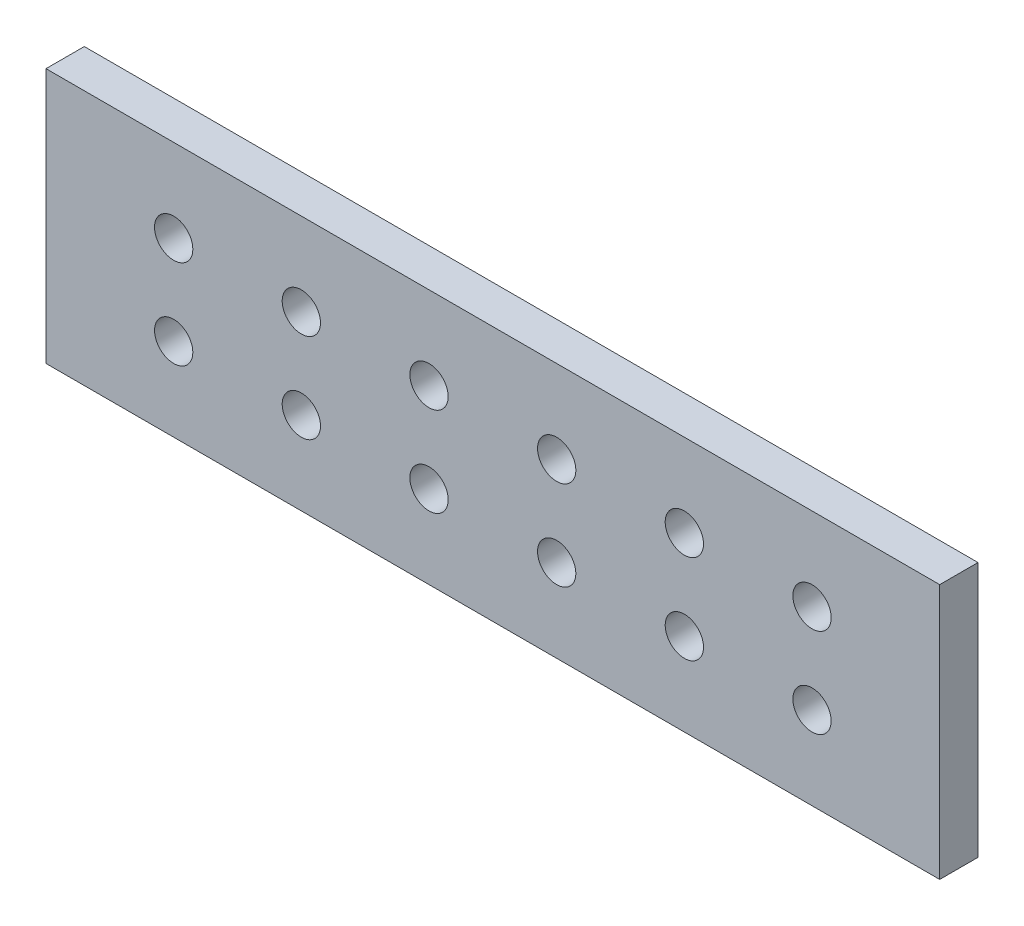
ISO-10303-21;
HEADER;
FILE_DESCRIPTION(('STEP AP214'),'2;1');
FILE_NAME('part.step','',(''),(''),'','','');
FILE_SCHEMA(('AUTOMOTIVE_DESIGN { 1 0 10303 214 1 1 1 1 }'));
ENDSEC;
DATA;
#1=APPLICATION_CONTEXT('core data for automotive mechanical design processes');
#2=APPLICATION_PROTOCOL_DEFINITION('international standard','automotive_design',2000,#1);
#3=PRODUCT_CONTEXT('',#1,'mechanical');
#4=PRODUCT('Part','Part','',(#3));
#5=PRODUCT_RELATED_PRODUCT_CATEGORY('part','',(#4));
#6=PRODUCT_DEFINITION_FORMATION('','',#4);
#7=PRODUCT_DEFINITION_CONTEXT('part definition',#1,'design');
#8=PRODUCT_DEFINITION('design','',#6,#7);
#9=PRODUCT_DEFINITION_SHAPE('','',#8);
#10=(LENGTH_UNIT() NAMED_UNIT(*) SI_UNIT(.MILLI.,.METRE.));
#11=(NAMED_UNIT(*) PLANE_ANGLE_UNIT() SI_UNIT($,.RADIAN.));
#12=(NAMED_UNIT(*) SI_UNIT($,.STERADIAN.) SOLID_ANGLE_UNIT());
#13=UNCERTAINTY_MEASURE_WITH_UNIT(LENGTH_MEASURE(1.E-05),#10,'distance_accuracy_value','');
#14=(GEOMETRIC_REPRESENTATION_CONTEXT(3) GLOBAL_UNCERTAINTY_ASSIGNED_CONTEXT((#13)) GLOBAL_UNIT_ASSIGNED_CONTEXT((#10,
#11,#12)) REPRESENTATION_CONTEXT('',''));
#15=CARTESIAN_POINT('',(0.,0.,0.));
#16=DIRECTION('',(0.,0.,1.));
#17=DIRECTION('',(1.,0.,0.));
#18=AXIS2_PLACEMENT_3D('',#15,#16,#17);
#19=CARTESIAN_POINT('',(0.,0.,3.));
#20=DIRECTION('',(0.,0.,1.));
#21=DIRECTION('',(1.,0.,0.));
#22=AXIS2_PLACEMENT_3D('',#19,#20,#21);
#23=PLANE('',#22);
#24=CARTESIAN_POINT('',(15.,-3.5,3.));
#25=DIRECTION('',(0.,0.,1.));
#26=DIRECTION('',(1.,0.,0.));
#27=AXIS2_PLACEMENT_3D('',#24,#25,#26);
#28=CIRCLE('',#27,1.5);
#29=CARTESIAN_POINT('',(16.5,-3.5,3.));
#30=VERTEX_POINT('',#29);
#31=EDGE_CURVE('E172',#30,#30,#28,.T.);
#32=ORIENTED_EDGE('',*,*,#31,.F.);
#33=EDGE_LOOP('',(#32));
#34=FACE_BOUND('',#33,.T.);
#35=CARTESIAN_POINT('',(-4.99999999999999,-3.5,3.));
#36=DIRECTION('',(0.,0.,1.));
#37=DIRECTION('',(1.,0.,0.));
#38=AXIS2_PLACEMENT_3D('',#35,#36,#37);
#39=CIRCLE('',#38,1.5);
#40=CARTESIAN_POINT('',(-3.49999999999999,-3.5,3.));
#41=VERTEX_POINT('',#40);
#42=EDGE_CURVE('E160',#41,#41,#39,.T.);
#43=ORIENTED_EDGE('',*,*,#42,.F.);
#44=EDGE_LOOP('',(#43));
#45=FACE_BOUND('',#44,.T.);
#46=CARTESIAN_POINT('',(25.,3.5,3.));
#47=DIRECTION('',(0.,0.,1.));
#48=DIRECTION('',(1.,0.,0.));
#49=AXIS2_PLACEMENT_3D('',#46,#47,#48);
#50=CIRCLE('',#49,1.5);
#51=CARTESIAN_POINT('',(26.5,3.5,3.));
#52=VERTEX_POINT('',#51);
#53=EDGE_CURVE('E148',#52,#52,#50,.T.);
#54=ORIENTED_EDGE('',*,*,#53,.F.);
#55=EDGE_LOOP('',(#54));
#56=FACE_BOUND('',#55,.T.);
#57=CARTESIAN_POINT('',(5.00000000000001,3.5,3.));
#58=DIRECTION('',(0.,0.,1.));
#59=DIRECTION('',(1.,0.,0.));
#60=AXIS2_PLACEMENT_3D('',#57,#58,#59);
#61=CIRCLE('',#60,1.5);
#62=CARTESIAN_POINT('',(6.50000000000002,3.5,3.));
#63=VERTEX_POINT('',#62);
#64=EDGE_CURVE('E136',#63,#63,#61,.T.);
#65=ORIENTED_EDGE('',*,*,#64,.F.);
#66=EDGE_LOOP('',(#65));
#67=FACE_BOUND('',#66,.T.);
#68=CARTESIAN_POINT('',(-15.,3.5,3.));
#69=DIRECTION('',(0.,0.,1.));
#70=DIRECTION('',(1.,0.,0.));
#71=AXIS2_PLACEMENT_3D('',#68,#69,#70);
#72=CIRCLE('',#71,1.5);
#73=CARTESIAN_POINT('',(-13.5,3.5,3.));
#74=VERTEX_POINT('',#73);
#75=EDGE_CURVE('E124',#74,#74,#72,.T.);
#76=ORIENTED_EDGE('',*,*,#75,.F.);
#77=EDGE_LOOP('',(#76));
#78=FACE_BOUND('',#77,.T.);
#79=CARTESIAN_POINT('',(-25.,3.5,3.));
#80=DIRECTION('',(0.,0.,1.));
#81=DIRECTION('',(1.,0.,0.));
#82=AXIS2_PLACEMENT_3D('',#79,#80,#81);
#83=CIRCLE('',#82,1.5);
#84=CARTESIAN_POINT('',(-23.5,3.5,3.));
#85=VERTEX_POINT('',#84);
#86=EDGE_CURVE('E103',#85,#85,#83,.T.);
#87=ORIENTED_EDGE('',*,*,#86,.F.);
#88=EDGE_LOOP('',(#87));
#89=FACE_BOUND('',#88,.T.);
#90=DIRECTION('',(0.,1.,0.));
#91=VECTOR('',#90,1.);
#92=CARTESIAN_POINT('',(35.,10.,3.));
#93=LINE('',#92,#91);
#94=CARTESIAN_POINT('',(35.,-10.,3.));
#95=VERTEX_POINT('',#94);
#96=CARTESIAN_POINT('',(35.,10.,3.));
#97=VERTEX_POINT('',#96);
#98=EDGE_CURVE('E88',#95,#97,#93,.T.);
#99=ORIENTED_EDGE('',*,*,#98,.T.);
#100=DIRECTION('',(-1.,0.,0.));
#101=VECTOR('',#100,1.);
#102=CARTESIAN_POINT('',(-35.,10.,3.));
#103=LINE('',#102,#101);
#104=CARTESIAN_POINT('',(-35.,10.,3.));
#105=VERTEX_POINT('',#104);
#106=EDGE_CURVE('E83',#97,#105,#103,.T.);
#107=ORIENTED_EDGE('',*,*,#106,.T.);
#108=DIRECTION('',(0.,-1.,0.));
#109=VECTOR('',#108,1.);
#110=CARTESIAN_POINT('',(-35.,10.,3.));
#111=LINE('',#110,#109);
#112=CARTESIAN_POINT('',(-35.,-10.,3.));
#113=VERTEX_POINT('',#112);
#114=EDGE_CURVE('E86',#105,#113,#111,.T.);
#115=ORIENTED_EDGE('',*,*,#114,.T.);
#116=DIRECTION('',(1.,0.,0.));
#117=VECTOR('',#116,1.);
#118=CARTESIAN_POINT('',(-35.,-10.,3.));
#119=LINE('',#118,#117);
#120=EDGE_CURVE('E53',#113,#95,#119,.T.);
#121=ORIENTED_EDGE('',*,*,#120,.T.);
#122=EDGE_LOOP('',(#99,#107,#115,#121));
#123=FACE_BOUND('',#122,.T.);
#124=CARTESIAN_POINT('',(-25.,-3.5,3.));
#125=DIRECTION('',(0.,0.,1.));
#126=DIRECTION('',(1.,0.,0.));
#127=AXIS2_PLACEMENT_3D('',#124,#125,#126);
#128=CIRCLE('',#127,1.5);
#129=CARTESIAN_POINT('',(-23.5,-3.5,3.));
#130=VERTEX_POINT('',#129);
#131=EDGE_CURVE('E118',#130,#130,#128,.T.);
#132=ORIENTED_EDGE('',*,*,#131,.F.);
#133=EDGE_LOOP('',(#132));
#134=FACE_BOUND('',#133,.T.);
#135=CARTESIAN_POINT('',(-4.99999999999999,3.5,3.));
#136=DIRECTION('',(0.,0.,1.));
#137=DIRECTION('',(1.,0.,0.));
#138=AXIS2_PLACEMENT_3D('',#135,#136,#137);
#139=CIRCLE('',#138,1.5);
#140=CARTESIAN_POINT('',(-3.49999999999999,3.5,3.));
#141=VERTEX_POINT('',#140);
#142=EDGE_CURVE('E130',#141,#141,#139,.T.);
#143=ORIENTED_EDGE('',*,*,#142,.F.);
#144=EDGE_LOOP('',(#143));
#145=FACE_BOUND('',#144,.T.);
#146=CARTESIAN_POINT('',(15.,3.5,3.));
#147=DIRECTION('',(0.,0.,1.));
#148=DIRECTION('',(1.,0.,0.));
#149=AXIS2_PLACEMENT_3D('',#146,#147,#148);
#150=CIRCLE('',#149,1.5);
#151=CARTESIAN_POINT('',(16.5,3.5,3.));
#152=VERTEX_POINT('',#151);
#153=EDGE_CURVE('E142',#152,#152,#150,.T.);
#154=ORIENTED_EDGE('',*,*,#153,.F.);
#155=EDGE_LOOP('',(#154));
#156=FACE_BOUND('',#155,.T.);
#157=CARTESIAN_POINT('',(-15.,-3.5,3.));
#158=DIRECTION('',(0.,0.,1.));
#159=DIRECTION('',(1.,0.,0.));
#160=AXIS2_PLACEMENT_3D('',#157,#158,#159);
#161=CIRCLE('',#160,1.5);
#162=CARTESIAN_POINT('',(-13.5,-3.5,3.));
#163=VERTEX_POINT('',#162);
#164=EDGE_CURVE('E154',#163,#163,#161,.T.);
#165=ORIENTED_EDGE('',*,*,#164,.F.);
#166=EDGE_LOOP('',(#165));
#167=FACE_BOUND('',#166,.T.);
#168=CARTESIAN_POINT('',(5.00000000000001,-3.5,3.));
#169=DIRECTION('',(0.,0.,1.));
#170=DIRECTION('',(1.,0.,0.));
#171=AXIS2_PLACEMENT_3D('',#168,#169,#170);
#172=CIRCLE('',#171,1.5);
#173=CARTESIAN_POINT('',(6.50000000000002,-3.5,3.));
#174=VERTEX_POINT('',#173);
#175=EDGE_CURVE('E166',#174,#174,#172,.T.);
#176=ORIENTED_EDGE('',*,*,#175,.F.);
#177=EDGE_LOOP('',(#176));
#178=FACE_BOUND('',#177,.T.);
#179=CARTESIAN_POINT('',(25.,-3.5,3.));
#180=DIRECTION('',(0.,0.,1.));
#181=DIRECTION('',(1.,0.,0.));
#182=AXIS2_PLACEMENT_3D('',#179,#180,#181);
#183=CIRCLE('',#182,1.5);
#184=CARTESIAN_POINT('',(26.5,-3.5,3.));
#185=VERTEX_POINT('',#184);
#186=EDGE_CURVE('E178',#185,#185,#183,.T.);
#187=ORIENTED_EDGE('',*,*,#186,.F.);
#188=EDGE_LOOP('',(#187));
#189=FACE_BOUND('',#188,.T.);
#190=ADVANCED_FACE('F36',(#34,#45,#56,#67,#78,#89,#123,#134,#145,#156,#167,#178,#189),#23,.T.);
#191=CARTESIAN_POINT('',(0.,0.,0.));
#192=DIRECTION('',(0.,0.,1.));
#193=DIRECTION('',(1.,0.,0.));
#194=AXIS2_PLACEMENT_3D('',#191,#192,#193);
#195=PLANE('',#194);
#196=DIRECTION('',(0.,1.,0.));
#197=VECTOR('',#196,1.);
#198=CARTESIAN_POINT('',(35.,10.,0.));
#199=LINE('',#198,#197);
#200=CARTESIAN_POINT('',(35.,-10.,0.));
#201=VERTEX_POINT('',#200);
#202=CARTESIAN_POINT('',(35.,10.,0.));
#203=VERTEX_POINT('',#202);
#204=EDGE_CURVE('E100',#201,#203,#199,.T.);
#205=ORIENTED_EDGE('',*,*,#204,.F.);
#206=DIRECTION('',(1.,0.,0.));
#207=VECTOR('',#206,1.);
#208=CARTESIAN_POINT('',(-35.,-10.,0.));
#209=LINE('',#208,#207);
#210=CARTESIAN_POINT('',(-35.,-10.,0.));
#211=VERTEX_POINT('',#210);
#212=EDGE_CURVE('E76',#211,#201,#209,.T.);
#213=ORIENTED_EDGE('',*,*,#212,.F.);
#214=DIRECTION('',(0.,-1.,0.));
#215=VECTOR('',#214,1.);
#216=CARTESIAN_POINT('',(-35.,10.,0.));
#217=LINE('',#216,#215);
#218=CARTESIAN_POINT('',(-35.,10.,0.));
#219=VERTEX_POINT('',#218);
#220=EDGE_CURVE('E70',#219,#211,#217,.T.);
#221=ORIENTED_EDGE('',*,*,#220,.F.);
#222=DIRECTION('',(-1.,0.,0.));
#223=VECTOR('',#222,1.);
#224=CARTESIAN_POINT('',(-35.,10.,0.));
#225=LINE('',#224,#223);
#226=EDGE_CURVE('E92',#203,#219,#225,.T.);
#227=ORIENTED_EDGE('',*,*,#226,.F.);
#228=EDGE_LOOP('',(#205,#213,#221,#227));
#229=FACE_BOUND('',#228,.T.);
#230=CARTESIAN_POINT('',(-25.,3.5,0.));
#231=DIRECTION('',(0.,0.,1.));
#232=DIRECTION('',(1.,0.,0.));
#233=AXIS2_PLACEMENT_3D('',#230,#231,#232);
#234=CIRCLE('',#233,1.5);
#235=CARTESIAN_POINT('',(-23.5,3.5,0.));
#236=VERTEX_POINT('',#235);
#237=EDGE_CURVE('E115',#236,#236,#234,.T.);
#238=ORIENTED_EDGE('',*,*,#237,.T.);
#239=EDGE_LOOP('',(#238));
#240=FACE_BOUND('',#239,.T.);
#241=CARTESIAN_POINT('',(-25.,-3.5,0.));
#242=DIRECTION('',(0.,0.,1.));
#243=DIRECTION('',(1.,0.,0.));
#244=AXIS2_PLACEMENT_3D('',#241,#242,#243);
#245=CIRCLE('',#244,1.5);
#246=CARTESIAN_POINT('',(-23.5,-3.5,0.));
#247=VERTEX_POINT('',#246);
#248=EDGE_CURVE('E121',#247,#247,#245,.T.);
#249=ORIENTED_EDGE('',*,*,#248,.T.);
#250=EDGE_LOOP('',(#249));
#251=FACE_BOUND('',#250,.T.);
#252=CARTESIAN_POINT('',(-15.,3.5,0.));
#253=DIRECTION('',(0.,0.,1.));
#254=DIRECTION('',(1.,0.,0.));
#255=AXIS2_PLACEMENT_3D('',#252,#253,#254);
#256=CIRCLE('',#255,1.5);
#257=CARTESIAN_POINT('',(-13.5,3.5,0.));
#258=VERTEX_POINT('',#257);
#259=EDGE_CURVE('E127',#258,#258,#256,.T.);
#260=ORIENTED_EDGE('',*,*,#259,.T.);
#261=EDGE_LOOP('',(#260));
#262=FACE_BOUND('',#261,.T.);
#263=CARTESIAN_POINT('',(-4.99999999999999,3.5,0.));
#264=DIRECTION('',(0.,0.,1.));
#265=DIRECTION('',(1.,0.,0.));
#266=AXIS2_PLACEMENT_3D('',#263,#264,#265);
#267=CIRCLE('',#266,1.5);
#268=CARTESIAN_POINT('',(-3.49999999999999,3.5,0.));
#269=VERTEX_POINT('',#268);
#270=EDGE_CURVE('E133',#269,#269,#267,.T.);
#271=ORIENTED_EDGE('',*,*,#270,.T.);
#272=EDGE_LOOP('',(#271));
#273=FACE_BOUND('',#272,.T.);
#274=CARTESIAN_POINT('',(5.00000000000001,3.5,0.));
#275=DIRECTION('',(0.,0.,1.));
#276=DIRECTION('',(1.,0.,0.));
#277=AXIS2_PLACEMENT_3D('',#274,#275,#276);
#278=CIRCLE('',#277,1.5);
#279=CARTESIAN_POINT('',(6.50000000000002,3.5,0.));
#280=VERTEX_POINT('',#279);
#281=EDGE_CURVE('E139',#280,#280,#278,.T.);
#282=ORIENTED_EDGE('',*,*,#281,.T.);
#283=EDGE_LOOP('',(#282));
#284=FACE_BOUND('',#283,.T.);
#285=CARTESIAN_POINT('',(15.,3.5,0.));
#286=DIRECTION('',(0.,0.,1.));
#287=DIRECTION('',(1.,0.,0.));
#288=AXIS2_PLACEMENT_3D('',#285,#286,#287);
#289=CIRCLE('',#288,1.5);
#290=CARTESIAN_POINT('',(16.5,3.5,0.));
#291=VERTEX_POINT('',#290);
#292=EDGE_CURVE('E145',#291,#291,#289,.T.);
#293=ORIENTED_EDGE('',*,*,#292,.T.);
#294=EDGE_LOOP('',(#293));
#295=FACE_BOUND('',#294,.T.);
#296=CARTESIAN_POINT('',(25.,3.5,0.));
#297=DIRECTION('',(0.,0.,1.));
#298=DIRECTION('',(1.,0.,0.));
#299=AXIS2_PLACEMENT_3D('',#296,#297,#298);
#300=CIRCLE('',#299,1.5);
#301=CARTESIAN_POINT('',(26.5,3.5,0.));
#302=VERTEX_POINT('',#301);
#303=EDGE_CURVE('E151',#302,#302,#300,.T.);
#304=ORIENTED_EDGE('',*,*,#303,.T.);
#305=EDGE_LOOP('',(#304));
#306=FACE_BOUND('',#305,.T.);
#307=CARTESIAN_POINT('',(-15.,-3.5,0.));
#308=DIRECTION('',(0.,0.,1.));
#309=DIRECTION('',(1.,0.,0.));
#310=AXIS2_PLACEMENT_3D('',#307,#308,#309);
#311=CIRCLE('',#310,1.5);
#312=CARTESIAN_POINT('',(-13.5,-3.5,0.));
#313=VERTEX_POINT('',#312);
#314=EDGE_CURVE('E157',#313,#313,#311,.T.);
#315=ORIENTED_EDGE('',*,*,#314,.T.);
#316=EDGE_LOOP('',(#315));
#317=FACE_BOUND('',#316,.T.);
#318=CARTESIAN_POINT('',(-4.99999999999999,-3.5,0.));
#319=DIRECTION('',(0.,0.,1.));
#320=DIRECTION('',(1.,0.,0.));
#321=AXIS2_PLACEMENT_3D('',#318,#319,#320);
#322=CIRCLE('',#321,1.5);
#323=CARTESIAN_POINT('',(-3.49999999999999,-3.5,0.));
#324=VERTEX_POINT('',#323);
#325=EDGE_CURVE('E163',#324,#324,#322,.T.);
#326=ORIENTED_EDGE('',*,*,#325,.T.);
#327=EDGE_LOOP('',(#326));
#328=FACE_BOUND('',#327,.T.);
#329=CARTESIAN_POINT('',(5.00000000000001,-3.5,0.));
#330=DIRECTION('',(0.,0.,1.));
#331=DIRECTION('',(1.,0.,0.));
#332=AXIS2_PLACEMENT_3D('',#329,#330,#331);
#333=CIRCLE('',#332,1.5);
#334=CARTESIAN_POINT('',(6.50000000000002,-3.5,0.));
#335=VERTEX_POINT('',#334);
#336=EDGE_CURVE('E169',#335,#335,#333,.T.);
#337=ORIENTED_EDGE('',*,*,#336,.T.);
#338=EDGE_LOOP('',(#337));
#339=FACE_BOUND('',#338,.T.);
#340=CARTESIAN_POINT('',(15.,-3.5,0.));
#341=DIRECTION('',(0.,0.,1.));
#342=DIRECTION('',(1.,0.,0.));
#343=AXIS2_PLACEMENT_3D('',#340,#341,#342);
#344=CIRCLE('',#343,1.5);
#345=CARTESIAN_POINT('',(16.5,-3.5,0.));
#346=VERTEX_POINT('',#345);
#347=EDGE_CURVE('E175',#346,#346,#344,.T.);
#348=ORIENTED_EDGE('',*,*,#347,.T.);
#349=EDGE_LOOP('',(#348));
#350=FACE_BOUND('',#349,.T.);
#351=CARTESIAN_POINT('',(25.,-3.5,0.));
#352=DIRECTION('',(0.,0.,1.));
#353=DIRECTION('',(1.,0.,0.));
#354=AXIS2_PLACEMENT_3D('',#351,#352,#353);
#355=CIRCLE('',#354,1.5);
#356=CARTESIAN_POINT('',(26.5,-3.5,0.));
#357=VERTEX_POINT('',#356);
#358=EDGE_CURVE('E181',#357,#357,#355,.T.);
#359=ORIENTED_EDGE('',*,*,#358,.T.);
#360=EDGE_LOOP('',(#359));
#361=FACE_BOUND('',#360,.T.);
#362=ADVANCED_FACE('F111',(#229,#240,#251,#262,#273,#284,#295,#306,#317,#328,#339,#350,#361),
#195,.F.);
#363=CARTESIAN_POINT('',(35.,10.,3.));
#364=DIRECTION('',(-1.,0.,0.));
#365=DIRECTION('',(0.,0.,1.));
#366=AXIS2_PLACEMENT_3D('',#363,#364,#365);
#367=PLANE('',#366);
#368=ORIENTED_EDGE('',*,*,#204,.T.);
#369=DIRECTION('',(0.,0.,-1.));
#370=VECTOR('',#369,1.);
#371=CARTESIAN_POINT('',(35.,10.,3.));
#372=LINE('',#371,#370);
#373=EDGE_CURVE('E11',#97,#203,#372,.T.);
#374=ORIENTED_EDGE('',*,*,#373,.F.);
#375=ORIENTED_EDGE('',*,*,#98,.F.);
#376=DIRECTION('',(0.,0.,-1.));
#377=VECTOR('',#376,1.);
#378=CARTESIAN_POINT('',(35.,-10.,3.));
#379=LINE('',#378,#377);
#380=EDGE_CURVE('E96',#95,#201,#379,.T.);
#381=ORIENTED_EDGE('',*,*,#380,.T.);
#382=EDGE_LOOP('',(#368,#374,#375,#381));
#383=FACE_BOUND('',#382,.T.);
#384=ADVANCED_FACE('F38',(#383),#367,.F.);
#385=CARTESIAN_POINT('',(-35.,10.,3.));
#386=DIRECTION('',(0.,-1.,0.));
#387=DIRECTION('',(0.,0.,-1.));
#388=AXIS2_PLACEMENT_3D('',#385,#386,#387);
#389=PLANE('',#388);
#390=ORIENTED_EDGE('',*,*,#226,.T.);
#391=DIRECTION('',(0.,0.,-1.));
#392=VECTOR('',#391,1.);
#393=CARTESIAN_POINT('',(-35.,10.,3.));
#394=LINE('',#393,#392);
#395=EDGE_CURVE('E45',#105,#219,#394,.T.);
#396=ORIENTED_EDGE('',*,*,#395,.F.);
#397=ORIENTED_EDGE('',*,*,#106,.F.);
#398=ORIENTED_EDGE('',*,*,#373,.T.);
#399=EDGE_LOOP('',(#390,#396,#397,#398));
#400=FACE_BOUND('',#399,.T.);
#401=ADVANCED_FACE('F91',(#400),#389,.F.);
#402=CARTESIAN_POINT('',(-35.,10.,3.));
#403=DIRECTION('',(1.,0.,0.));
#404=DIRECTION('',(0.,0.,-1.));
#405=AXIS2_PLACEMENT_3D('',#402,#403,#404);
#406=PLANE('',#405);
#407=ORIENTED_EDGE('',*,*,#220,.T.);
#408=DIRECTION('',(0.,0.,-1.));
#409=VECTOR('',#408,1.);
#410=CARTESIAN_POINT('',(-35.,-10.,3.));
#411=LINE('',#410,#409);
#412=EDGE_CURVE('E93',#113,#211,#411,.T.);
#413=ORIENTED_EDGE('',*,*,#412,.F.);
#414=ORIENTED_EDGE('',*,*,#114,.F.);
#415=ORIENTED_EDGE('',*,*,#395,.T.);
#416=EDGE_LOOP('',(#407,#413,#414,#415));
#417=FACE_BOUND('',#416,.T.);
#418=ADVANCED_FACE('F94',(#417),#406,.F.);
#419=CARTESIAN_POINT('',(-35.,-10.,3.));
#420=DIRECTION('',(0.,1.,0.));
#421=DIRECTION('',(0.,0.,1.));
#422=AXIS2_PLACEMENT_3D('',#419,#420,#421);
#423=PLANE('',#422);
#424=ORIENTED_EDGE('',*,*,#212,.T.);
#425=ORIENTED_EDGE('',*,*,#380,.F.);
#426=ORIENTED_EDGE('',*,*,#120,.F.);
#427=ORIENTED_EDGE('',*,*,#412,.T.);
#428=EDGE_LOOP('',(#424,#425,#426,#427));
#429=FACE_BOUND('',#428,.T.);
#430=ADVANCED_FACE('F108',(#429),#423,.F.);
#431=CARTESIAN_POINT('',(-25.,3.5,3.));
#432=DIRECTION('',(0.,0.,-1.));
#433=DIRECTION('',(-1.,0.,0.));
#434=AXIS2_PLACEMENT_3D('',#431,#432,#433);
#435=CYLINDRICAL_SURFACE('',#434,1.5);
#436=ORIENTED_EDGE('',*,*,#86,.T.);
#437=EDGE_LOOP('',(#436));
#438=FACE_BOUND('',#437,.T.);
#439=ORIENTED_EDGE('',*,*,#237,.F.);
#440=EDGE_LOOP('',(#439));
#441=FACE_BOUND('',#440,.T.);
#442=ADVANCED_FACE('F200',(#438,#441),#435,.F.);
#443=CARTESIAN_POINT('',(-25.,-3.5,3.));
#444=DIRECTION('',(0.,0.,-1.));
#445=DIRECTION('',(-1.,0.,0.));
#446=AXIS2_PLACEMENT_3D('',#443,#444,#445);
#447=CYLINDRICAL_SURFACE('',#446,1.5);
#448=ORIENTED_EDGE('',*,*,#131,.T.);
#449=EDGE_LOOP('',(#448));
#450=FACE_BOUND('',#449,.T.);
#451=ORIENTED_EDGE('',*,*,#248,.F.);
#452=EDGE_LOOP('',(#451));
#453=FACE_BOUND('',#452,.T.);
#454=ADVANCED_FACE('F246',(#450,#453),#447,.F.);
#455=CARTESIAN_POINT('',(-15.,3.5,3.));
#456=DIRECTION('',(0.,0.,-1.));
#457=DIRECTION('',(-1.,0.,0.));
#458=AXIS2_PLACEMENT_3D('',#455,#456,#457);
#459=CYLINDRICAL_SURFACE('',#458,1.5);
#460=ORIENTED_EDGE('',*,*,#75,.T.);
#461=EDGE_LOOP('',(#460));
#462=FACE_BOUND('',#461,.T.);
#463=ORIENTED_EDGE('',*,*,#259,.F.);
#464=EDGE_LOOP('',(#463));
#465=FACE_BOUND('',#464,.T.);
#466=ADVANCED_FACE('F254',(#462,#465),#459,.F.);
#467=CARTESIAN_POINT('',(-4.99999999999999,3.5,3.));
#468=DIRECTION('',(0.,0.,-1.));
#469=DIRECTION('',(-1.,0.,0.));
#470=AXIS2_PLACEMENT_3D('',#467,#468,#469);
#471=CYLINDRICAL_SURFACE('',#470,1.5);
#472=ORIENTED_EDGE('',*,*,#142,.T.);
#473=EDGE_LOOP('',(#472));
#474=FACE_BOUND('',#473,.T.);
#475=ORIENTED_EDGE('',*,*,#270,.F.);
#476=EDGE_LOOP('',(#475));
#477=FACE_BOUND('',#476,.T.);
#478=ADVANCED_FACE('F262',(#474,#477),#471,.F.);
#479=CARTESIAN_POINT('',(5.00000000000001,3.5,3.));
#480=DIRECTION('',(0.,0.,-1.));
#481=DIRECTION('',(-1.,0.,0.));
#482=AXIS2_PLACEMENT_3D('',#479,#480,#481);
#483=CYLINDRICAL_SURFACE('',#482,1.5);
#484=ORIENTED_EDGE('',*,*,#64,.T.);
#485=EDGE_LOOP('',(#484));
#486=FACE_BOUND('',#485,.T.);
#487=ORIENTED_EDGE('',*,*,#281,.F.);
#488=EDGE_LOOP('',(#487));
#489=FACE_BOUND('',#488,.T.);
#490=ADVANCED_FACE('F271',(#486,#489),#483,.F.);
#491=CARTESIAN_POINT('',(15.,3.5,3.));
#492=DIRECTION('',(0.,0.,-1.));
#493=DIRECTION('',(-1.,0.,0.));
#494=AXIS2_PLACEMENT_3D('',#491,#492,#493);
#495=CYLINDRICAL_SURFACE('',#494,1.5);
#496=ORIENTED_EDGE('',*,*,#153,.T.);
#497=EDGE_LOOP('',(#496));
#498=FACE_BOUND('',#497,.T.);
#499=ORIENTED_EDGE('',*,*,#292,.F.);
#500=EDGE_LOOP('',(#499));
#501=FACE_BOUND('',#500,.T.);
#502=ADVANCED_FACE('F280',(#498,#501),#495,.F.);
#503=CARTESIAN_POINT('',(25.,3.5,3.));
#504=DIRECTION('',(0.,0.,-1.));
#505=DIRECTION('',(-1.,0.,0.));
#506=AXIS2_PLACEMENT_3D('',#503,#504,#505);
#507=CYLINDRICAL_SURFACE('',#506,1.5);
#508=ORIENTED_EDGE('',*,*,#53,.T.);
#509=EDGE_LOOP('',(#508));
#510=FACE_BOUND('',#509,.T.);
#511=ORIENTED_EDGE('',*,*,#303,.F.);
#512=EDGE_LOOP('',(#511));
#513=FACE_BOUND('',#512,.T.);
#514=ADVANCED_FACE('F289',(#510,#513),#507,.F.);
#515=CARTESIAN_POINT('',(-15.,-3.5,3.));
#516=DIRECTION('',(0.,0.,-1.));
#517=DIRECTION('',(-1.,0.,0.));
#518=AXIS2_PLACEMENT_3D('',#515,#516,#517);
#519=CYLINDRICAL_SURFACE('',#518,1.5);
#520=ORIENTED_EDGE('',*,*,#164,.T.);
#521=EDGE_LOOP('',(#520));
#522=FACE_BOUND('',#521,.T.);
#523=ORIENTED_EDGE('',*,*,#314,.F.);
#524=EDGE_LOOP('',(#523));
#525=FACE_BOUND('',#524,.T.);
#526=ADVANCED_FACE('F298',(#522,#525),#519,.F.);
#527=CARTESIAN_POINT('',(-4.99999999999999,-3.5,3.));
#528=DIRECTION('',(0.,0.,-1.));
#529=DIRECTION('',(-1.,0.,0.));
#530=AXIS2_PLACEMENT_3D('',#527,#528,#529);
#531=CYLINDRICAL_SURFACE('',#530,1.5);
#532=ORIENTED_EDGE('',*,*,#42,.T.);
#533=EDGE_LOOP('',(#532));
#534=FACE_BOUND('',#533,.T.);
#535=ORIENTED_EDGE('',*,*,#325,.F.);
#536=EDGE_LOOP('',(#535));
#537=FACE_BOUND('',#536,.T.);
#538=ADVANCED_FACE('F307',(#534,#537),#531,.F.);
#539=CARTESIAN_POINT('',(5.00000000000001,-3.5,3.));
#540=DIRECTION('',(0.,0.,-1.));
#541=DIRECTION('',(-1.,0.,0.));
#542=AXIS2_PLACEMENT_3D('',#539,#540,#541);
#543=CYLINDRICAL_SURFACE('',#542,1.5);
#544=ORIENTED_EDGE('',*,*,#175,.T.);
#545=EDGE_LOOP('',(#544));
#546=FACE_BOUND('',#545,.T.);
#547=ORIENTED_EDGE('',*,*,#336,.F.);
#548=EDGE_LOOP('',(#547));
#549=FACE_BOUND('',#548,.T.);
#550=ADVANCED_FACE('F316',(#546,#549),#543,.F.);
#551=CARTESIAN_POINT('',(15.,-3.5,3.));
#552=DIRECTION('',(0.,0.,-1.));
#553=DIRECTION('',(-1.,0.,0.));
#554=AXIS2_PLACEMENT_3D('',#551,#552,#553);
#555=CYLINDRICAL_SURFACE('',#554,1.5);
#556=ORIENTED_EDGE('',*,*,#31,.T.);
#557=EDGE_LOOP('',(#556));
#558=FACE_BOUND('',#557,.T.);
#559=ORIENTED_EDGE('',*,*,#347,.F.);
#560=EDGE_LOOP('',(#559));
#561=FACE_BOUND('',#560,.T.);
#562=ADVANCED_FACE('F325',(#558,#561),#555,.F.);
#563=CARTESIAN_POINT('',(25.,-3.5,3.));
#564=DIRECTION('',(0.,0.,-1.));
#565=DIRECTION('',(-1.,0.,0.));
#566=AXIS2_PLACEMENT_3D('',#563,#564,#565);
#567=CYLINDRICAL_SURFACE('',#566,1.5);
#568=ORIENTED_EDGE('',*,*,#186,.T.);
#569=EDGE_LOOP('',(#568));
#570=FACE_BOUND('',#569,.T.);
#571=ORIENTED_EDGE('',*,*,#358,.F.);
#572=EDGE_LOOP('',(#571));
#573=FACE_BOUND('',#572,.T.);
#574=ADVANCED_FACE('F187',(#570,#573),#567,.F.);
#575=CLOSED_SHELL('',(#190,#362,#384,#401,#418,#430,#442,#454,#466,#478,#490,#502,#514,#526,
#538,#550,#562,#574));
#576=MANIFOLD_SOLID_BREP('B2',#575);
#577=ADVANCED_BREP_SHAPE_REPRESENTATION('',(#18,#576),#14);
#578=SHAPE_DEFINITION_REPRESENTATION(#9,#577);
ENDSEC;
END-ISO-10303-21;
